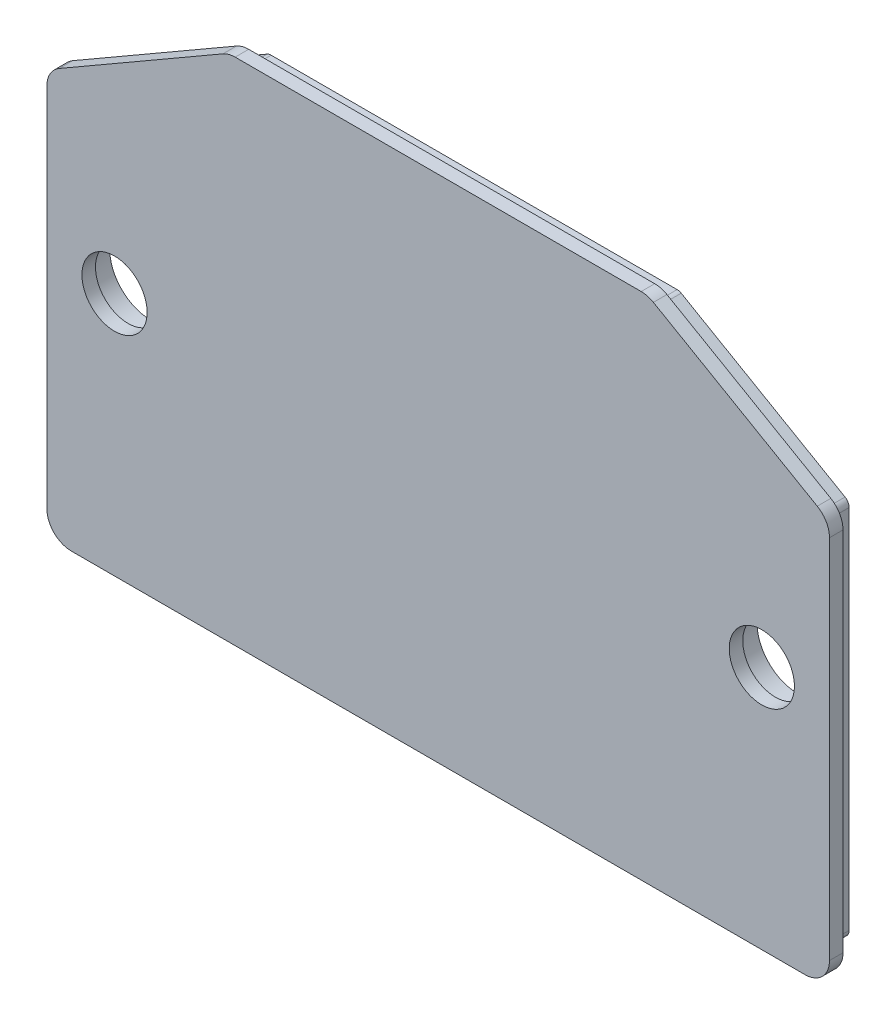
ISO-10303-21;
HEADER;
FILE_DESCRIPTION(('STEP AP214'),'2;1');
FILE_NAME('part.step','',(''),(''),'','','');
FILE_SCHEMA(('AUTOMOTIVE_DESIGN { 1 0 10303 214 1 1 1 1 }'));
ENDSEC;
DATA;
#1=APPLICATION_CONTEXT('core data for automotive mechanical design processes');
#2=APPLICATION_PROTOCOL_DEFINITION('international standard','automotive_design',2000,#1);
#3=PRODUCT_CONTEXT('',#1,'mechanical');
#4=PRODUCT('Part','Part','',(#3));
#5=PRODUCT_RELATED_PRODUCT_CATEGORY('part','',(#4));
#6=PRODUCT_DEFINITION_FORMATION('','',#4);
#7=PRODUCT_DEFINITION_CONTEXT('part definition',#1,'design');
#8=PRODUCT_DEFINITION('design','',#6,#7);
#9=PRODUCT_DEFINITION_SHAPE('','',#8);
#10=(LENGTH_UNIT() NAMED_UNIT(*) SI_UNIT(.MILLI.,.METRE.));
#11=(NAMED_UNIT(*) PLANE_ANGLE_UNIT() SI_UNIT($,.RADIAN.));
#12=(NAMED_UNIT(*) SI_UNIT($,.STERADIAN.) SOLID_ANGLE_UNIT());
#13=UNCERTAINTY_MEASURE_WITH_UNIT(LENGTH_MEASURE(1.E-05),#10,'distance_accuracy_value','');
#14=(GEOMETRIC_REPRESENTATION_CONTEXT(3) GLOBAL_UNCERTAINTY_ASSIGNED_CONTEXT((#13)) GLOBAL_UNIT_ASSIGNED_CONTEXT((#10,
#11,#12)) REPRESENTATION_CONTEXT('',''));
#15=CARTESIAN_POINT('',(0.,0.,0.));
#16=DIRECTION('',(0.,0.,1.));
#17=DIRECTION('',(1.,0.,0.));
#18=AXIS2_PLACEMENT_3D('',#15,#16,#17);
#19=CARTESIAN_POINT('',(0.,0.,-25.271));
#20=DIRECTION('',(0.,0.,-1.));
#21=DIRECTION('',(-1.,0.,0.));
#22=AXIS2_PLACEMENT_3D('',#19,#20,#21);
#23=PLANE('',#22);
#24=CARTESIAN_POINT('',(8.87,-19.26674933975,-25.271));
#25=DIRECTION('',(0.,0.,-1.));
#26=DIRECTION('',(-1.,0.,0.));
#27=AXIS2_PLACEMENT_3D('',#24,#25,#26);
#28=CIRCLE('',#27,0.5);
#29=CARTESIAN_POINT('',(8.37,-19.26674933975,-25.271));
#30=VERTEX_POINT('',#29);
#31=EDGE_CURVE('E201',#30,#30,#28,.F.);
#32=ORIENTED_EDGE('',*,*,#31,.T.);
#33=EDGE_LOOP('',(#32));
#34=FACE_BOUND('',#33,.T.);
#35=CARTESIAN_POINT('',(0.93,-19.26674933975,-25.271));
#36=DIRECTION('',(0.,0.,-1.));
#37=DIRECTION('',(-1.,0.,0.));
#38=AXIS2_PLACEMENT_3D('',#35,#36,#37);
#39=CIRCLE('',#38,0.5);
#40=CARTESIAN_POINT('',(0.43,-19.26674933975,-25.271));
#41=VERTEX_POINT('',#40);
#42=EDGE_CURVE('E198',#41,#41,#39,.F.);
#43=ORIENTED_EDGE('',*,*,#42,.T.);
#44=EDGE_LOOP('',(#43));
#45=FACE_BOUND('',#44,.T.);
#46=CARTESIAN_POINT('',(2.410031582968,-16.31454744111,-25.271));
#47=DIRECTION('',(0.,0.,-1.));
#48=DIRECTION('',(-1.,0.,0.));
#49=AXIS2_PLACEMENT_3D('',#46,#47,#48);
#50=CIRCLE('',#49,0.1);
#51=CARTESIAN_POINT('',(2.410031582968,-16.21454744111,-25.271));
#52=VERTEX_POINT('',#51);
#53=CARTESIAN_POINT('',(2.36003158296767,-16.2279449007302,-25.271));
#54=VERTEX_POINT('',#53);
#55=EDGE_CURVE('E19',#52,#54,#50,.F.);
#56=ORIENTED_EDGE('',*,*,#55,.F.);
#57=DIRECTION('',(1.,0.,0.));
#58=VECTOR('',#57,1.);
#59=CARTESIAN_POINT('',(7.389968417032,-16.21454744111,-25.271));
#60=LINE('',#59,#58);
#61=CARTESIAN_POINT('',(7.389968417032,-16.21454744111,-25.271));
#62=VERTEX_POINT('',#61);
#63=EDGE_CURVE('E175',#52,#62,#60,.T.);
#64=ORIENTED_EDGE('',*,*,#63,.T.);
#65=CARTESIAN_POINT('',(7.389968417032,-16.31454744111,-25.271));
#66=DIRECTION('',(0.,0.,-1.));
#67=DIRECTION('',(-1.,0.,0.));
#68=AXIS2_PLACEMENT_3D('',#65,#66,#67);
#69=CIRCLE('',#68,0.1);
#70=CARTESIAN_POINT('',(7.43996841703119,-16.2279449007322,-25.271));
#71=VERTEX_POINT('',#70);
#72=EDGE_CURVE('E186',#71,#62,#69,.F.);
#73=ORIENTED_EDGE('',*,*,#72,.F.);
#74=DIRECTION('',(0.866025403784429,-0.500000000000017,0.));
#75=VECTOR('',#74,1.);
#76=CARTESIAN_POINT('',(9.45,-17.38843717624,-25.271));
#77=LINE('',#76,#75);
#78=CARTESIAN_POINT('',(9.45000000000034,-17.3884371762402,-25.271));
#79=VERTEX_POINT('',#78);
#80=EDGE_CURVE('E212',#71,#79,#77,.T.);
#81=ORIENTED_EDGE('',*,*,#80,.T.);
#82=CARTESIAN_POINT('',(9.4,-17.47503971662,-25.271));
#83=DIRECTION('',(0.,0.,-1.));
#84=DIRECTION('',(-1.,0.,0.));
#85=AXIS2_PLACEMENT_3D('',#82,#83,#84);
#86=CIRCLE('',#85,0.1);
#87=CARTESIAN_POINT('',(9.5,-17.47503971662,-25.271));
#88=VERTEX_POINT('',#87);
#89=EDGE_CURVE('E216',#88,#79,#86,.F.);
#90=ORIENTED_EDGE('',*,*,#89,.F.);
#91=DIRECTION('',(0.,1.,0.));
#92=VECTOR('',#91,1.);
#93=CARTESIAN_POINT('',(9.5,-21.96674933975,-25.271));
#94=LINE('',#93,#92);
#95=CARTESIAN_POINT('',(9.5,-21.96674933975,-25.271));
#96=VERTEX_POINT('',#95);
#97=EDGE_CURVE('E220',#88,#96,#94,.F.);
#98=ORIENTED_EDGE('',*,*,#97,.T.);
#99=CARTESIAN_POINT('',(9.4,-21.96674933975,-25.271));
#100=DIRECTION('',(0.,0.,-1.));
#101=DIRECTION('',(-1.,0.,0.));
#102=AXIS2_PLACEMENT_3D('',#99,#100,#101);
#103=CIRCLE('',#102,0.1);
#104=CARTESIAN_POINT('',(9.4,-22.06674933975,-25.271));
#105=VERTEX_POINT('',#104);
#106=EDGE_CURVE('E224',#105,#96,#103,.F.);
#107=ORIENTED_EDGE('',*,*,#106,.F.);
#108=DIRECTION('',(1.,0.,0.));
#109=VECTOR('',#108,1.);
#110=CARTESIAN_POINT('',(0.4,-22.06674933975,-25.271));
#111=LINE('',#110,#109);
#112=CARTESIAN_POINT('',(0.4,-22.06674933975,-25.271));
#113=VERTEX_POINT('',#112);
#114=EDGE_CURVE('E228',#105,#113,#111,.F.);
#115=ORIENTED_EDGE('',*,*,#114,.T.);
#116=CARTESIAN_POINT('',(0.4,-21.96674933975,-25.271));
#117=DIRECTION('',(0.,0.,-1.));
#118=DIRECTION('',(-1.,0.,0.));
#119=AXIS2_PLACEMENT_3D('',#116,#117,#118);
#120=CIRCLE('',#119,0.1);
#121=CARTESIAN_POINT('',(0.3,-21.96674933975,-25.271));
#122=VERTEX_POINT('',#121);
#123=EDGE_CURVE('E232',#122,#113,#120,.F.);
#124=ORIENTED_EDGE('',*,*,#123,.F.);
#125=DIRECTION('',(0.,1.,0.));
#126=VECTOR('',#125,1.);
#127=CARTESIAN_POINT('',(0.3,-17.47503971662,-25.271));
#128=LINE('',#127,#126);
#129=CARTESIAN_POINT('',(0.3,-17.47503971662,-25.271));
#130=VERTEX_POINT('',#129);
#131=EDGE_CURVE('E236',#122,#130,#128,.T.);
#132=ORIENTED_EDGE('',*,*,#131,.T.);
#133=CARTESIAN_POINT('',(0.4,-17.47503971662,-25.271));
#134=DIRECTION('',(0.,0.,-1.));
#135=DIRECTION('',(-1.,0.,0.));
#136=AXIS2_PLACEMENT_3D('',#133,#134,#135);
#137=CIRCLE('',#136,0.1);
#138=CARTESIAN_POINT('',(0.349999999999194,-17.3884371762394,-25.271));
#139=VERTEX_POINT('',#138);
#140=EDGE_CURVE('E240',#139,#130,#137,.F.);
#141=ORIENTED_EDGE('',*,*,#140,.F.);
#142=DIRECTION('',(0.866025403784429,0.500000000000017,0.));
#143=VECTOR('',#142,1.);
#144=CARTESIAN_POINT('',(2.360031582968,-16.22794490073,-25.271));
#145=LINE('',#144,#143);
#146=EDGE_CURVE('E191',#139,#54,#145,.T.);
#147=ORIENTED_EDGE('',*,*,#146,.T.);
#148=EDGE_LOOP('',(#56,#64,#73,#81,#90,#98,#107,#115,#124,#132,#141,#147));
#149=FACE_BOUND('',#148,.T.);
#150=ADVANCED_FACE('F16',(#34,#45,#149),#23,.T.);
#151=CARTESIAN_POINT('',(2.410031582968,-16.31454744111,-25.271));
#152=DIRECTION('',(0.,0.,-1.));
#153=DIRECTION('',(-1.,0.,0.));
#154=AXIS2_PLACEMENT_3D('',#151,#152,#153);
#155=CYLINDRICAL_SURFACE('',#154,0.1);
#156=DIRECTION('',(0.,0.,-1.));
#157=VECTOR('',#156,1.);
#158=CARTESIAN_POINT('',(2.410031582968,-16.21454744111,-25.271));
#159=LINE('',#158,#157);
#160=CARTESIAN_POINT('',(2.410031582968,-16.21454744111,-24.996));
#161=VERTEX_POINT('',#160);
#162=EDGE_CURVE('E180',#161,#52,#159,.T.);
#163=ORIENTED_EDGE('',*,*,#162,.T.);
#164=ORIENTED_EDGE('',*,*,#55,.T.);
#165=DIRECTION('',(0.,0.,1.));
#166=VECTOR('',#165,1.);
#167=CARTESIAN_POINT('',(2.360031582968,-16.22794490073,-25.271));
#168=LINE('',#167,#166);
#169=CARTESIAN_POINT('',(2.36003158296761,-16.2279449007302,-24.996));
#170=VERTEX_POINT('',#169);
#171=EDGE_CURVE('E241',#54,#170,#168,.T.);
#172=ORIENTED_EDGE('',*,*,#171,.T.);
#173=CARTESIAN_POINT('',(2.410031582968,-16.31454744111,-24.996));
#174=DIRECTION('',(0.,0.,-1.));
#175=DIRECTION('',(-1.,0.,0.));
#176=AXIS2_PLACEMENT_3D('',#173,#174,#175);
#177=CIRCLE('',#176,0.1);
#178=EDGE_CURVE('E197',#161,#170,#177,.F.);
#179=ORIENTED_EDGE('',*,*,#178,.F.);
#180=EDGE_LOOP('',(#163,#164,#172,#179));
#181=FACE_BOUND('',#180,.T.);
#182=ADVANCED_FACE('F196',(#181),#155,.T.);
#183=CARTESIAN_POINT('',(2.360031582968,-16.22794490073,-25.271));
#184=DIRECTION('',(0.500000000000017,-0.866025403784429,0.));
#185=DIRECTION('',(0.866025403784429,0.500000000000017,0.));
#186=AXIS2_PLACEMENT_3D('',#183,#184,#185);
#187=PLANE('',#186);
#188=DIRECTION('',(-0.866025403783734,-0.50000000000122,0.));
#189=VECTOR('',#188,1.);
#190=CARTESIAN_POINT('',(2.360031582968,-16.22794490073,-24.996));
#191=LINE('',#190,#189);
#192=CARTESIAN_POINT('',(0.349999999999939,-17.3884371762408,-24.996));
#193=VERTEX_POINT('',#192);
#194=EDGE_CURVE('E333',#170,#193,#191,.T.);
#195=ORIENTED_EDGE('',*,*,#194,.F.);
#196=ORIENTED_EDGE('',*,*,#171,.F.);
#197=ORIENTED_EDGE('',*,*,#146,.F.);
#198=DIRECTION('',(0.,0.,-1.));
#199=VECTOR('',#198,1.);
#200=CARTESIAN_POINT('',(0.350000000000674,-17.3884371762412,-25.271));
#201=LINE('',#200,#199);
#202=EDGE_CURVE('E237',#193,#139,#201,.T.);
#203=ORIENTED_EDGE('',*,*,#202,.F.);
#204=EDGE_LOOP('',(#195,#196,#197,#203));
#205=FACE_BOUND('',#204,.T.);
#206=ADVANCED_FACE('F403',(#205),#187,.F.);
#207=CARTESIAN_POINT('',(0.4,-17.47503971662,-25.271));
#208=DIRECTION('',(0.,0.,-1.));
#209=DIRECTION('',(-1.,0.,0.));
#210=AXIS2_PLACEMENT_3D('',#207,#208,#209);
#211=CYLINDRICAL_SURFACE('',#210,0.1);
#212=ORIENTED_EDGE('',*,*,#202,.T.);
#213=ORIENTED_EDGE('',*,*,#140,.T.);
#214=DIRECTION('',(0.,0.,-1.));
#215=VECTOR('',#214,1.);
#216=CARTESIAN_POINT('',(0.3,-17.47503971662,-25.271));
#217=LINE('',#216,#215);
#218=CARTESIAN_POINT('',(0.3,-17.47503971662,-24.996));
#219=VERTEX_POINT('',#218);
#220=EDGE_CURVE('E233',#130,#219,#217,.F.);
#221=ORIENTED_EDGE('',*,*,#220,.T.);
#222=CARTESIAN_POINT('',(0.4,-17.47503971662,-24.996));
#223=DIRECTION('',(0.,0.,-1.));
#224=DIRECTION('',(-1.,0.,0.));
#225=AXIS2_PLACEMENT_3D('',#222,#223,#224);
#226=CIRCLE('',#225,0.1);
#227=EDGE_CURVE('E331',#193,#219,#226,.F.);
#228=ORIENTED_EDGE('',*,*,#227,.F.);
#229=EDGE_LOOP('',(#212,#213,#221,#228));
#230=FACE_BOUND('',#229,.T.);
#231=ADVANCED_FACE('F342',(#230),#211,.T.);
#232=CARTESIAN_POINT('',(0.3,-17.47503971662,-25.271));
#233=DIRECTION('',(1.,0.,0.));
#234=DIRECTION('',(0.,0.,-1.));
#235=AXIS2_PLACEMENT_3D('',#232,#233,#234);
#236=PLANE('',#235);
#237=DIRECTION('',(0.,1.,0.));
#238=VECTOR('',#237,1.);
#239=CARTESIAN_POINT('',(0.3,0.,-24.996));
#240=LINE('',#239,#238);
#241=CARTESIAN_POINT('',(0.3,-21.96674933975,-24.996));
#242=VERTEX_POINT('',#241);
#243=EDGE_CURVE('E330',#219,#242,#240,.F.);
#244=ORIENTED_EDGE('',*,*,#243,.F.);
#245=ORIENTED_EDGE('',*,*,#220,.F.);
#246=ORIENTED_EDGE('',*,*,#131,.F.);
#247=DIRECTION('',(0.,0.,-1.));
#248=VECTOR('',#247,1.);
#249=CARTESIAN_POINT('',(0.3,-21.96674933975,-25.271));
#250=LINE('',#249,#248);
#251=EDGE_CURVE('E229',#242,#122,#250,.T.);
#252=ORIENTED_EDGE('',*,*,#251,.F.);
#253=EDGE_LOOP('',(#244,#245,#246,#252));
#254=FACE_BOUND('',#253,.T.);
#255=ADVANCED_FACE('F347',(#254),#236,.F.);
#256=CARTESIAN_POINT('',(0.4,-21.96674933975,-25.271));
#257=DIRECTION('',(0.,0.,-1.));
#258=DIRECTION('',(-1.,0.,0.));
#259=AXIS2_PLACEMENT_3D('',#256,#257,#258);
#260=CYLINDRICAL_SURFACE('',#259,0.1);
#261=ORIENTED_EDGE('',*,*,#251,.T.);
#262=ORIENTED_EDGE('',*,*,#123,.T.);
#263=DIRECTION('',(0.,0.,1.));
#264=VECTOR('',#263,1.);
#265=CARTESIAN_POINT('',(0.4,-22.06674933975,-25.271));
#266=LINE('',#265,#264);
#267=CARTESIAN_POINT('',(0.4,-22.06674933975,-24.996));
#268=VERTEX_POINT('',#267);
#269=EDGE_CURVE('E225',#113,#268,#266,.T.);
#270=ORIENTED_EDGE('',*,*,#269,.T.);
#271=CARTESIAN_POINT('',(0.4,-21.96674933975,-24.996));
#272=DIRECTION('',(0.,0.,-1.));
#273=DIRECTION('',(-1.,0.,0.));
#274=AXIS2_PLACEMENT_3D('',#271,#272,#273);
#275=CIRCLE('',#274,0.1);
#276=EDGE_CURVE('E328',#242,#268,#275,.F.);
#277=ORIENTED_EDGE('',*,*,#276,.F.);
#278=EDGE_LOOP('',(#261,#262,#270,#277));
#279=FACE_BOUND('',#278,.T.);
#280=ADVANCED_FACE('F353',(#279),#260,.T.);
#281=CARTESIAN_POINT('',(0.4,-22.06674933975,-25.271));
#282=DIRECTION('',(0.,1.,0.));
#283=DIRECTION('',(0.,0.,1.));
#284=AXIS2_PLACEMENT_3D('',#281,#282,#283);
#285=PLANE('',#284);
#286=DIRECTION('',(-1.,0.,0.));
#287=VECTOR('',#286,1.);
#288=CARTESIAN_POINT('',(0.,-22.06674933975,-24.996));
#289=LINE('',#288,#287);
#290=CARTESIAN_POINT('',(9.4,-22.06674933975,-24.996));
#291=VERTEX_POINT('',#290);
#292=EDGE_CURVE('E327',#268,#291,#289,.F.);
#293=ORIENTED_EDGE('',*,*,#292,.F.);
#294=ORIENTED_EDGE('',*,*,#269,.F.);
#295=ORIENTED_EDGE('',*,*,#114,.F.);
#296=DIRECTION('',(0.,0.,-1.));
#297=VECTOR('',#296,1.);
#298=CARTESIAN_POINT('',(9.4,-22.06674933975,-25.271));
#299=LINE('',#298,#297);
#300=EDGE_CURVE('E221',#291,#105,#299,.T.);
#301=ORIENTED_EDGE('',*,*,#300,.F.);
#302=EDGE_LOOP('',(#293,#294,#295,#301));
#303=FACE_BOUND('',#302,.T.);
#304=ADVANCED_FACE('F357',(#303),#285,.F.);
#305=CARTESIAN_POINT('',(9.4,-21.96674933975,-25.271));
#306=DIRECTION('',(0.,0.,-1.));
#307=DIRECTION('',(-1.,0.,0.));
#308=AXIS2_PLACEMENT_3D('',#305,#306,#307);
#309=CYLINDRICAL_SURFACE('',#308,0.1);
#310=ORIENTED_EDGE('',*,*,#300,.T.);
#311=ORIENTED_EDGE('',*,*,#106,.T.);
#312=DIRECTION('',(0.,0.,1.));
#313=VECTOR('',#312,1.);
#314=CARTESIAN_POINT('',(9.5,-21.96674933975,-25.271));
#315=LINE('',#314,#313);
#316=CARTESIAN_POINT('',(9.5,-21.96674933975,-24.996));
#317=VERTEX_POINT('',#316);
#318=EDGE_CURVE('E217',#96,#317,#315,.T.);
#319=ORIENTED_EDGE('',*,*,#318,.T.);
#320=CARTESIAN_POINT('',(9.4,-21.96674933975,-24.996));
#321=DIRECTION('',(0.,0.,-1.));
#322=DIRECTION('',(-1.,0.,0.));
#323=AXIS2_PLACEMENT_3D('',#320,#321,#322);
#324=CIRCLE('',#323,0.1);
#325=EDGE_CURVE('E325',#291,#317,#324,.F.);
#326=ORIENTED_EDGE('',*,*,#325,.F.);
#327=EDGE_LOOP('',(#310,#311,#319,#326));
#328=FACE_BOUND('',#327,.T.);
#329=ADVANCED_FACE('F508',(#328),#309,.T.);
#330=CARTESIAN_POINT('',(9.5,-21.96674933975,-25.271));
#331=DIRECTION('',(-1.,0.,0.));
#332=DIRECTION('',(0.,0.,1.));
#333=AXIS2_PLACEMENT_3D('',#330,#331,#332);
#334=PLANE('',#333);
#335=DIRECTION('',(0.,1.,0.));
#336=VECTOR('',#335,1.);
#337=CARTESIAN_POINT('',(9.5,0.,-24.996));
#338=LINE('',#337,#336);
#339=CARTESIAN_POINT('',(9.5,-17.47503971662,-24.996));
#340=VERTEX_POINT('',#339);
#341=EDGE_CURVE('E324',#317,#340,#338,.T.);
#342=ORIENTED_EDGE('',*,*,#341,.F.);
#343=ORIENTED_EDGE('',*,*,#318,.F.);
#344=ORIENTED_EDGE('',*,*,#97,.F.);
#345=DIRECTION('',(0.,0.,-1.));
#346=VECTOR('',#345,1.);
#347=CARTESIAN_POINT('',(9.5,-17.47503971662,-25.271));
#348=LINE('',#347,#346);
#349=EDGE_CURVE('E213',#340,#88,#348,.T.);
#350=ORIENTED_EDGE('',*,*,#349,.F.);
#351=EDGE_LOOP('',(#342,#343,#344,#350));
#352=FACE_BOUND('',#351,.T.);
#353=ADVANCED_FACE('F504',(#352),#334,.F.);
#354=CARTESIAN_POINT('',(9.4,-17.47503971662,-25.271));
#355=DIRECTION('',(0.,0.,-1.));
#356=DIRECTION('',(-1.,0.,0.));
#357=AXIS2_PLACEMENT_3D('',#354,#355,#356);
#358=CYLINDRICAL_SURFACE('',#357,0.1);
#359=ORIENTED_EDGE('',*,*,#349,.T.);
#360=ORIENTED_EDGE('',*,*,#89,.T.);
#361=DIRECTION('',(0.,0.,1.));
#362=VECTOR('',#361,1.);
#363=CARTESIAN_POINT('',(9.45,-17.38843717624,-25.271));
#364=LINE('',#363,#362);
#365=CARTESIAN_POINT('',(9.4500000000004,-17.3884371762403,-24.996));
#366=VERTEX_POINT('',#365);
#367=EDGE_CURVE('E209',#79,#366,#364,.T.);
#368=ORIENTED_EDGE('',*,*,#367,.T.);
#369=CARTESIAN_POINT('',(9.4,-17.47503971662,-24.996));
#370=DIRECTION('',(0.,0.,-1.));
#371=DIRECTION('',(-1.,0.,0.));
#372=AXIS2_PLACEMENT_3D('',#369,#370,#371);
#373=CIRCLE('',#372,0.1);
#374=EDGE_CURVE('E322',#340,#366,#373,.F.);
#375=ORIENTED_EDGE('',*,*,#374,.F.);
#376=EDGE_LOOP('',(#359,#360,#368,#375));
#377=FACE_BOUND('',#376,.T.);
#378=ADVANCED_FACE('F501',(#377),#358,.T.);
#379=CARTESIAN_POINT('',(9.45,-17.38843717624,-25.271));
#380=DIRECTION('',(-0.500000000000017,-0.866025403784429,0.));
#381=DIRECTION('',(0.866025403784429,-0.500000000000017,0.));
#382=AXIS2_PLACEMENT_3D('',#379,#380,#381);
#383=PLANE('',#382);
#384=DIRECTION('',(-0.866025403783734,0.50000000000122,0.));
#385=VECTOR('',#384,1.);
#386=CARTESIAN_POINT('',(9.45,-17.38843717624,-24.996));
#387=LINE('',#386,#385);
#388=CARTESIAN_POINT('',(7.43996841703206,-16.2279449007308,-24.996));
#389=VERTEX_POINT('',#388);
#390=EDGE_CURVE('E321',#366,#389,#387,.T.);
#391=ORIENTED_EDGE('',*,*,#390,.F.);
#392=ORIENTED_EDGE('',*,*,#367,.F.);
#393=ORIENTED_EDGE('',*,*,#80,.F.);
#394=DIRECTION('',(0.,0.,-1.));
#395=VECTOR('',#394,1.);
#396=CARTESIAN_POINT('',(7.43996841703133,-16.2279449007311,-25.271));
#397=LINE('',#396,#395);
#398=EDGE_CURVE('E206',#389,#71,#397,.T.);
#399=ORIENTED_EDGE('',*,*,#398,.F.);
#400=EDGE_LOOP('',(#391,#392,#393,#399));
#401=FACE_BOUND('',#400,.T.);
#402=ADVANCED_FACE('F398',(#401),#383,.F.);
#403=CARTESIAN_POINT('',(7.389968417032,-16.31454744111,-25.271));
#404=DIRECTION('',(0.,0.,-1.));
#405=DIRECTION('',(-1.,0.,0.));
#406=AXIS2_PLACEMENT_3D('',#403,#404,#405);
#407=CYLINDRICAL_SURFACE('',#406,0.1);
#408=ORIENTED_EDGE('',*,*,#398,.T.);
#409=ORIENTED_EDGE('',*,*,#72,.T.);
#410=DIRECTION('',(0.,0.,-1.));
#411=VECTOR('',#410,1.);
#412=CARTESIAN_POINT('',(7.389968417032,-16.21454744111,-25.271));
#413=LINE('',#412,#411);
#414=CARTESIAN_POINT('',(7.389968417032,-16.21454744111,-24.996));
#415=VERTEX_POINT('',#414);
#416=EDGE_CURVE('E183',#62,#415,#413,.F.);
#417=ORIENTED_EDGE('',*,*,#416,.T.);
#418=CARTESIAN_POINT('',(7.389968417032,-16.31454744111,-24.996));
#419=DIRECTION('',(0.,0.,-1.));
#420=DIRECTION('',(-1.,0.,0.));
#421=AXIS2_PLACEMENT_3D('',#418,#419,#420);
#422=CIRCLE('',#421,0.1);
#423=EDGE_CURVE('E319',#389,#415,#422,.F.);
#424=ORIENTED_EDGE('',*,*,#423,.F.);
#425=EDGE_LOOP('',(#408,#409,#417,#424));
#426=FACE_BOUND('',#425,.T.);
#427=ADVANCED_FACE('F400',(#426),#407,.T.);
#428=CARTESIAN_POINT('',(7.389968417032,-16.21454744111,-25.271));
#429=DIRECTION('',(0.,-1.,0.));
#430=DIRECTION('',(0.,0.,-1.));
#431=AXIS2_PLACEMENT_3D('',#428,#429,#430);
#432=PLANE('',#431);
#433=DIRECTION('',(-1.,0.,0.));
#434=VECTOR('',#433,1.);
#435=CARTESIAN_POINT('',(0.,-16.21454744111,-24.996));
#436=LINE('',#435,#434);
#437=EDGE_CURVE('E318',#415,#161,#436,.T.);
#438=ORIENTED_EDGE('',*,*,#437,.F.);
#439=ORIENTED_EDGE('',*,*,#416,.F.);
#440=ORIENTED_EDGE('',*,*,#63,.F.);
#441=ORIENTED_EDGE('',*,*,#162,.F.);
#442=EDGE_LOOP('',(#438,#439,#440,#441));
#443=FACE_BOUND('',#442,.T.);
#444=ADVANCED_FACE('F178',(#443),#432,.F.);
#445=CARTESIAN_POINT('',(0.93,-19.26674933975,-25.271));
#446=DIRECTION('',(0.,0.,-1.));
#447=DIRECTION('',(-1.,0.,0.));
#448=AXIS2_PLACEMENT_3D('',#445,#446,#447);
#449=CYLINDRICAL_SURFACE('',#448,0.5);
#450=CARTESIAN_POINT('',(0.93,-19.26674933975,-24.996));
#451=DIRECTION('',(0.,0.,-1.));
#452=DIRECTION('',(-1.,0.,0.));
#453=AXIS2_PLACEMENT_3D('',#450,#451,#452);
#454=CIRCLE('',#453,0.5);
#455=CARTESIAN_POINT('',(0.43,-19.26674933975,-24.996));
#456=VERTEX_POINT('',#455);
#457=EDGE_CURVE('E315',#456,#456,#454,.T.);
#458=ORIENTED_EDGE('',*,*,#457,.F.);
#459=EDGE_LOOP('',(#458));
#460=FACE_BOUND('',#459,.T.);
#461=ORIENTED_EDGE('',*,*,#42,.F.);
#462=EDGE_LOOP('',(#461));
#463=FACE_BOUND('',#462,.T.);
#464=ADVANCED_FACE('F490',(#460,#463),#449,.F.);
#465=CARTESIAN_POINT('',(8.87,-19.26674933975,-25.271));
#466=DIRECTION('',(0.,0.,-1.));
#467=DIRECTION('',(-1.,0.,0.));
#468=AXIS2_PLACEMENT_3D('',#465,#466,#467);
#469=CYLINDRICAL_SURFACE('',#468,0.5);
#470=CARTESIAN_POINT('',(8.87,-19.26674933975,-24.996));
#471=DIRECTION('',(0.,0.,-1.));
#472=DIRECTION('',(-1.,0.,0.));
#473=AXIS2_PLACEMENT_3D('',#470,#471,#472);
#474=CIRCLE('',#473,0.5);
#475=CARTESIAN_POINT('',(8.37,-19.26674933975,-24.996));
#476=VERTEX_POINT('',#475);
#477=EDGE_CURVE('E312',#476,#476,#474,.T.);
#478=ORIENTED_EDGE('',*,*,#477,.F.);
#479=EDGE_LOOP('',(#478));
#480=FACE_BOUND('',#479,.T.);
#481=ORIENTED_EDGE('',*,*,#31,.F.);
#482=EDGE_LOOP('',(#481));
#483=FACE_BOUND('',#482,.T.);
#484=ADVANCED_FACE('F487',(#480,#483),#469,.F.);
#485=CARTESIAN_POINT('',(0.,0.,-24.996));
#486=DIRECTION('',(0.,0.,-1.));
#487=DIRECTION('',(-1.,0.,0.));
#488=AXIS2_PLACEMENT_3D('',#485,#486,#487);
#489=PLANE('',#488);
#490=ORIENTED_EDGE('',*,*,#423,.T.);
#491=ORIENTED_EDGE('',*,*,#437,.T.);
#492=ORIENTED_EDGE('',*,*,#178,.T.);
#493=ORIENTED_EDGE('',*,*,#194,.T.);
#494=ORIENTED_EDGE('',*,*,#227,.T.);
#495=ORIENTED_EDGE('',*,*,#243,.T.);
#496=ORIENTED_EDGE('',*,*,#276,.T.);
#497=ORIENTED_EDGE('',*,*,#292,.T.);
#498=ORIENTED_EDGE('',*,*,#325,.T.);
#499=ORIENTED_EDGE('',*,*,#341,.T.);
#500=ORIENTED_EDGE('',*,*,#374,.T.);
#501=ORIENTED_EDGE('',*,*,#390,.T.);
#502=EDGE_LOOP('',(#490,#491,#492,#493,#494,#495,#496,#497,#498,#499,#500,#501));
#503=FACE_BOUND('',#502,.T.);
#504=CARTESIAN_POINT('',(7.389968417032,-16.31454744111,-24.996));
#505=DIRECTION('',(0.,0.,1.));
#506=DIRECTION('',(1.,0.,0.));
#507=AXIS2_PLACEMENT_3D('',#504,#505,#506);
#508=CIRCLE('',#507,0.3);
#509=CARTESIAN_POINT('',(7.53996841703237,-16.0547398199717,-24.996));
#510=VERTEX_POINT('',#509);
#511=CARTESIAN_POINT('',(7.389968417032,-16.01454744111,-24.996));
#512=VERTEX_POINT('',#511);
#513=EDGE_CURVE('E299',#510,#512,#508,.T.);
#514=ORIENTED_EDGE('',*,*,#513,.F.);
#515=DIRECTION('',(-0.866025403784429,0.500000000000017,0.));
#516=VECTOR('',#515,1.);
#517=CARTESIAN_POINT('',(7.4,-15.97392901672,-24.996));
#518=LINE('',#517,#516);
#519=CARTESIAN_POINT('',(9.55000000000049,-17.2152320954815,-24.996));
#520=VERTEX_POINT('',#519);
#521=EDGE_CURVE('E375',#520,#510,#518,.T.);
#522=ORIENTED_EDGE('',*,*,#521,.F.);
#523=CARTESIAN_POINT('',(9.4,-17.47503971662,-24.996));
#524=DIRECTION('',(0.,0.,1.));
#525=DIRECTION('',(1.,0.,0.));
#526=AXIS2_PLACEMENT_3D('',#523,#524,#525);
#527=CIRCLE('',#526,0.3);
#528=CARTESIAN_POINT('',(9.7,-17.47503971662,-24.996));
#529=VERTEX_POINT('',#528);
#530=EDGE_CURVE('E294',#529,#520,#527,.T.);
#531=ORIENTED_EDGE('',*,*,#530,.F.);
#532=DIRECTION('',(0.,1.,0.));
#533=VECTOR('',#532,1.);
#534=CARTESIAN_POINT('',(9.7,-17.30183463586,-24.996));
#535=LINE('',#534,#533);
#536=CARTESIAN_POINT('',(9.7,-21.96674933975,-24.996));
#537=VERTEX_POINT('',#536);
#538=EDGE_CURVE('E372',#537,#529,#535,.T.);
#539=ORIENTED_EDGE('',*,*,#538,.F.);
#540=CARTESIAN_POINT('',(9.4,-21.96674933975,-24.996));
#541=DIRECTION('',(0.,0.,1.));
#542=DIRECTION('',(1.,0.,0.));
#543=AXIS2_PLACEMENT_3D('',#540,#541,#542);
#544=CIRCLE('',#543,0.3);
#545=CARTESIAN_POINT('',(9.4,-22.26674933975,-24.996));
#546=VERTEX_POINT('',#545);
#547=EDGE_CURVE('E289',#546,#537,#544,.T.);
#548=ORIENTED_EDGE('',*,*,#547,.F.);
#549=DIRECTION('',(1.,0.,0.));
#550=VECTOR('',#549,1.);
#551=CARTESIAN_POINT('',(9.7,-22.26674933975,-24.996));
#552=LINE('',#551,#550);
#553=CARTESIAN_POINT('',(0.4,-22.26674933975,-24.996));
#554=VERTEX_POINT('',#553);
#555=EDGE_CURVE('E369',#554,#546,#552,.T.);
#556=ORIENTED_EDGE('',*,*,#555,.F.);
#557=CARTESIAN_POINT('',(0.4,-21.96674933975,-24.996));
#558=DIRECTION('',(0.,0.,1.));
#559=DIRECTION('',(1.,0.,0.));
#560=AXIS2_PLACEMENT_3D('',#557,#558,#559);
#561=CIRCLE('',#560,0.3);
#562=CARTESIAN_POINT('',(0.1,-21.96674933975,-24.996));
#563=VERTEX_POINT('',#562);
#564=EDGE_CURVE('E285',#563,#554,#561,.T.);
#565=ORIENTED_EDGE('',*,*,#564,.F.);
#566=DIRECTION('',(0.,1.,0.));
#567=VECTOR('',#566,1.);
#568=CARTESIAN_POINT('',(0.1,-22.26674933975,-24.996));
#569=LINE('',#568,#567);
#570=CARTESIAN_POINT('',(0.1,-17.47503971662,-24.996));
#571=VERTEX_POINT('',#570);
#572=EDGE_CURVE('E284',#571,#563,#569,.F.);
#573=ORIENTED_EDGE('',*,*,#572,.F.);
#574=CARTESIAN_POINT('',(0.4,-17.47503971662,-24.996));
#575=DIRECTION('',(0.,0.,1.));
#576=DIRECTION('',(1.,0.,0.));
#577=AXIS2_PLACEMENT_3D('',#574,#575,#576);
#578=CIRCLE('',#577,0.3);
#579=CARTESIAN_POINT('',(0.24999999999966,-17.2152320954818,-24.996));
#580=VERTEX_POINT('',#579);
#581=EDGE_CURVE('E309',#580,#571,#578,.T.);
#582=ORIENTED_EDGE('',*,*,#581,.F.);
#583=DIRECTION('',(-0.866025403784429,-0.500000000000017,0.));
#584=VECTOR('',#583,1.);
#585=CARTESIAN_POINT('',(0.1,-17.30183463586,-24.996));
#586=LINE('',#585,#584);
#587=CARTESIAN_POINT('',(2.26003158296914,-16.0547398199743,-24.996));
#588=VERTEX_POINT('',#587);
#589=EDGE_CURVE('E379',#588,#580,#586,.T.);
#590=ORIENTED_EDGE('',*,*,#589,.F.);
#591=CARTESIAN_POINT('',(2.410031582968,-16.31454744111,-24.996));
#592=DIRECTION('',(0.,0.,-1.));
#593=DIRECTION('',(-1.,0.,0.));
#594=AXIS2_PLACEMENT_3D('',#591,#592,#593);
#595=CIRCLE('',#594,0.3);
#596=CARTESIAN_POINT('',(2.410031582968,-16.01454744111,-24.996));
#597=VERTEX_POINT('',#596);
#598=EDGE_CURVE('E304',#597,#588,#595,.F.);
#599=ORIENTED_EDGE('',*,*,#598,.F.);
#600=DIRECTION('',(1.,0.,0.));
#601=VECTOR('',#600,1.);
#602=CARTESIAN_POINT('',(9.4605,-16.01454744111,-24.996));
#603=LINE('',#602,#601);
#604=EDGE_CURVE('E307',#597,#512,#603,.T.);
#605=ORIENTED_EDGE('',*,*,#604,.T.);
#606=EDGE_LOOP('',(#514,#522,#531,#539,#548,#556,#565,#573,#582,#590,#599,#605));
#607=FACE_BOUND('',#606,.T.);
#608=ADVANCED_FACE('F392',(#503,#607),#489,.T.);
#609=CARTESIAN_POINT('',(0.,0.,-24.996));
#610=DIRECTION('',(0.,0.,-1.));
#611=DIRECTION('',(-1.,0.,0.));
#612=AXIS2_PLACEMENT_3D('',#609,#610,#611);
#613=PLANE('',#612);
#614=CARTESIAN_POINT('',(0.93,-19.26674933975,-24.996));
#615=DIRECTION('',(0.,0.,1.));
#616=DIRECTION('',(1.,0.,0.));
#617=AXIS2_PLACEMENT_3D('',#614,#615,#616);
#618=CIRCLE('',#617,0.4);
#619=CARTESIAN_POINT('',(1.33,-19.26674933975,-24.996));
#620=VERTEX_POINT('',#619);
#621=EDGE_CURVE('E281',#620,#620,#618,.T.);
#622=ORIENTED_EDGE('',*,*,#621,.T.);
#623=EDGE_LOOP('',(#622));
#624=FACE_BOUND('',#623,.T.);
#625=ORIENTED_EDGE('',*,*,#457,.T.);
#626=EDGE_LOOP('',(#625));
#627=FACE_BOUND('',#626,.T.);
#628=ADVANCED_FACE('F480',(#624,#627),#613,.T.);
#629=CARTESIAN_POINT('',(0.,0.,-24.996));
#630=DIRECTION('',(0.,0.,-1.));
#631=DIRECTION('',(-1.,0.,0.));
#632=AXIS2_PLACEMENT_3D('',#629,#630,#631);
#633=PLANE('',#632);
#634=CARTESIAN_POINT('',(8.87,-19.26674933975,-24.996));
#635=DIRECTION('',(0.,0.,1.));
#636=DIRECTION('',(1.,0.,0.));
#637=AXIS2_PLACEMENT_3D('',#634,#635,#636);
#638=CIRCLE('',#637,0.4);
#639=CARTESIAN_POINT('',(9.27,-19.26674933975,-24.996));
#640=VERTEX_POINT('',#639);
#641=EDGE_CURVE('E278',#640,#640,#638,.T.);
#642=ORIENTED_EDGE('',*,*,#641,.T.);
#643=EDGE_LOOP('',(#642));
#644=FACE_BOUND('',#643,.T.);
#645=ORIENTED_EDGE('',*,*,#477,.T.);
#646=EDGE_LOOP('',(#645));
#647=FACE_BOUND('',#646,.T.);
#648=ADVANCED_FACE('F476',(#644,#647),#633,.T.);
#649=CARTESIAN_POINT('',(0.4,-17.47503971662,-27.02967114666));
#650=DIRECTION('',(0.,0.,1.));
#651=DIRECTION('',(1.,0.,0.));
#652=AXIS2_PLACEMENT_3D('',#649,#650,#651);
#653=CYLINDRICAL_SURFACE('',#652,0.3);
#654=DIRECTION('',(0.,0.,1.));
#655=VECTOR('',#654,1.);
#656=CARTESIAN_POINT('',(0.250000000000672,-17.2152320954812,-25.271));
#657=LINE('',#656,#655);
#658=CARTESIAN_POINT('',(0.249999999999143,-17.2152320954813,-24.83));
#659=VERTEX_POINT('',#658);
#660=EDGE_CURVE('E311',#580,#659,#657,.T.);
#661=ORIENTED_EDGE('',*,*,#660,.F.);
#662=ORIENTED_EDGE('',*,*,#581,.T.);
#663=DIRECTION('',(0.,0.,1.));
#664=VECTOR('',#663,1.);
#665=CARTESIAN_POINT('',(0.1,-17.47503971662,-25.271));
#666=LINE('',#665,#664);
#667=CARTESIAN_POINT('',(0.1,-17.47503971662,-24.83));
#668=VERTEX_POINT('',#667);
#669=EDGE_CURVE('E368',#668,#571,#666,.F.);
#670=ORIENTED_EDGE('',*,*,#669,.F.);
#671=CARTESIAN_POINT('',(0.4,-17.47503971662,-24.83));
#672=DIRECTION('',(0.,0.,1.));
#673=DIRECTION('',(1.,0.,0.));
#674=AXIS2_PLACEMENT_3D('',#671,#672,#673);
#675=CIRCLE('',#674,0.3);
#676=EDGE_CURVE('E275',#668,#659,#675,.F.);
#677=ORIENTED_EDGE('',*,*,#676,.T.);
#678=EDGE_LOOP('',(#661,#662,#670,#677));
#679=FACE_BOUND('',#678,.T.);
#680=ADVANCED_FACE('F473',(#679),#653,.T.);
#681=CARTESIAN_POINT('',(0.1,-17.30183463586,-25.271));
#682=DIRECTION('',(-0.500000000000017,0.866025403784429,0.));
#683=DIRECTION('',(-0.866025403784429,-0.500000000000017,0.));
#684=AXIS2_PLACEMENT_3D('',#681,#682,#683);
#685=PLANE('',#684);
#686=DIRECTION('',(0.,0.,-1.));
#687=VECTOR('',#686,1.);
#688=CARTESIAN_POINT('',(2.26003158297002,-16.0547398199735,-22.16324083044));
#689=LINE('',#688,#687);
#690=CARTESIAN_POINT('',(2.26003158296782,-16.0547398199725,-24.83));
#691=VERTEX_POINT('',#690);
#692=EDGE_CURVE('E308',#588,#691,#689,.F.);
#693=ORIENTED_EDGE('',*,*,#692,.F.);
#694=ORIENTED_EDGE('',*,*,#589,.T.);
#695=ORIENTED_EDGE('',*,*,#660,.T.);
#696=DIRECTION('',(0.866025403783734,0.500000000001221,0.));
#697=VECTOR('',#696,1.);
#698=CARTESIAN_POINT('',(0.25,-17.21523209548,-24.83));
#699=LINE('',#698,#697);
#700=EDGE_CURVE('E274',#659,#691,#699,.T.);
#701=ORIENTED_EDGE('',*,*,#700,.T.);
#702=EDGE_LOOP('',(#693,#694,#695,#701));
#703=FACE_BOUND('',#702,.T.);
#704=ADVANCED_FACE('F469',(#703),#685,.T.);
#705=CARTESIAN_POINT('',(2.410031582968,-16.31454744111,-22.16324083044));
#706=DIRECTION('',(0.,0.,-1.));
#707=DIRECTION('',(-1.,0.,0.));
#708=AXIS2_PLACEMENT_3D('',#705,#706,#707);
#709=CYLINDRICAL_SURFACE('',#708,0.3);
#710=DIRECTION('',(0.,0.,-1.));
#711=VECTOR('',#710,1.);
#712=CARTESIAN_POINT('',(2.410031582968,-16.01454744111,-25.40590880229));
#713=LINE('',#712,#711);
#714=CARTESIAN_POINT('',(2.410031582968,-16.01454744111,-24.83));
#715=VERTEX_POINT('',#714);
#716=EDGE_CURVE('E378',#715,#597,#713,.T.);
#717=ORIENTED_EDGE('',*,*,#716,.T.);
#718=ORIENTED_EDGE('',*,*,#598,.T.);
#719=ORIENTED_EDGE('',*,*,#692,.T.);
#720=CARTESIAN_POINT('',(2.410031582968,-16.31454744111,-24.83));
#721=DIRECTION('',(0.,0.,-1.));
#722=DIRECTION('',(-1.,0.,0.));
#723=AXIS2_PLACEMENT_3D('',#720,#721,#722);
#724=CIRCLE('',#723,0.3);
#725=EDGE_CURVE('E271',#691,#715,#724,.T.);
#726=ORIENTED_EDGE('',*,*,#725,.T.);
#727=EDGE_LOOP('',(#717,#718,#719,#726));
#728=FACE_BOUND('',#727,.T.);
#729=ADVANCED_FACE('F465',(#728),#709,.T.);
#730=CARTESIAN_POINT('',(9.4605,-16.01454744111,-25.40590880229));
#731=DIRECTION('',(0.,-1.,0.));
#732=DIRECTION('',(0.,0.,-1.));
#733=AXIS2_PLACEMENT_3D('',#730,#731,#732);
#734=PLANE('',#733);
#735=DIRECTION('',(-1.,0.,0.));
#736=VECTOR('',#735,1.);
#737=CARTESIAN_POINT('',(0.,-16.01454744111,-24.83));
#738=LINE('',#737,#736);
#739=CARTESIAN_POINT('',(7.389968417032,-16.01454744111,-24.83));
#740=VERTEX_POINT('',#739);
#741=EDGE_CURVE('E270',#715,#740,#738,.F.);
#742=ORIENTED_EDGE('',*,*,#741,.T.);
#743=DIRECTION('',(0.,0.,1.));
#744=VECTOR('',#743,1.);
#745=CARTESIAN_POINT('',(7.389968417032,-16.01454744111,-27.02967114666));
#746=LINE('',#745,#744);
#747=EDGE_CURVE('E303',#512,#740,#746,.T.);
#748=ORIENTED_EDGE('',*,*,#747,.F.);
#749=ORIENTED_EDGE('',*,*,#604,.F.);
#750=ORIENTED_EDGE('',*,*,#716,.F.);
#751=EDGE_LOOP('',(#742,#748,#749,#750));
#752=FACE_BOUND('',#751,.T.);
#753=ADVANCED_FACE('F461',(#752),#734,.F.);
#754=CARTESIAN_POINT('',(7.389968417032,-16.31454744111,-27.02967114666));
#755=DIRECTION('',(0.,0.,1.));
#756=DIRECTION('',(1.,0.,0.));
#757=AXIS2_PLACEMENT_3D('',#754,#755,#756);
#758=CYLINDRICAL_SURFACE('',#757,0.3);
#759=DIRECTION('',(0.,0.,1.));
#760=VECTOR('',#759,1.);
#761=CARTESIAN_POINT('',(7.53996841703136,-16.0547398199711,-25.271));
#762=LINE('',#761,#760);
#763=CARTESIAN_POINT('',(7.53996841703288,-16.0547398199712,-24.83));
#764=VERTEX_POINT('',#763);
#765=EDGE_CURVE('E302',#510,#764,#762,.T.);
#766=ORIENTED_EDGE('',*,*,#765,.F.);
#767=ORIENTED_EDGE('',*,*,#513,.T.);
#768=ORIENTED_EDGE('',*,*,#747,.T.);
#769=CARTESIAN_POINT('',(7.389968417032,-16.31454744111,-24.83));
#770=DIRECTION('',(0.,0.,1.));
#771=DIRECTION('',(1.,0.,0.));
#772=AXIS2_PLACEMENT_3D('',#769,#770,#771);
#773=CIRCLE('',#772,0.3);
#774=EDGE_CURVE('E267',#740,#764,#773,.F.);
#775=ORIENTED_EDGE('',*,*,#774,.T.);
#776=EDGE_LOOP('',(#766,#767,#768,#775));
#777=FACE_BOUND('',#776,.T.);
#778=ADVANCED_FACE('F457',(#777),#758,.T.);
#779=CARTESIAN_POINT('',(7.4,-15.97392901672,-25.271));
#780=DIRECTION('',(0.500000000000017,0.866025403784429,0.));
#781=DIRECTION('',(-0.866025403784429,0.500000000000017,0.));
#782=AXIS2_PLACEMENT_3D('',#779,#780,#781);
#783=PLANE('',#782);
#784=DIRECTION('',(0.,0.,1.));
#785=VECTOR('',#784,1.);
#786=CARTESIAN_POINT('',(9.54999999999798,-17.2152320954835,-27.02967114666));
#787=LINE('',#786,#785);
#788=CARTESIAN_POINT('',(9.55000000000018,-17.2152320954825,-24.83));
#789=VERTEX_POINT('',#788);
#790=EDGE_CURVE('E298',#520,#789,#787,.T.);
#791=ORIENTED_EDGE('',*,*,#790,.F.);
#792=ORIENTED_EDGE('',*,*,#521,.T.);
#793=ORIENTED_EDGE('',*,*,#765,.T.);
#794=DIRECTION('',(0.866025403783734,-0.500000000001221,0.));
#795=VECTOR('',#794,1.);
#796=CARTESIAN_POINT('',(7.539968417032,-16.05473981997,-24.83));
#797=LINE('',#796,#795);
#798=EDGE_CURVE('E266',#764,#789,#797,.T.);
#799=ORIENTED_EDGE('',*,*,#798,.T.);
#800=EDGE_LOOP('',(#791,#792,#793,#799));
#801=FACE_BOUND('',#800,.T.);
#802=ADVANCED_FACE('F453',(#801),#783,.T.);
#803=CARTESIAN_POINT('',(9.4,-17.47503971662,-27.02967114666));
#804=DIRECTION('',(0.,0.,1.));
#805=DIRECTION('',(1.,0.,0.));
#806=AXIS2_PLACEMENT_3D('',#803,#804,#805);
#807=CYLINDRICAL_SURFACE('',#806,0.3);
#808=DIRECTION('',(0.,0.,-1.));
#809=VECTOR('',#808,1.);
#810=CARTESIAN_POINT('',(9.7,-17.47503971662,-25.271));
#811=LINE('',#810,#809);
#812=CARTESIAN_POINT('',(9.7,-17.47503971662,-24.83));
#813=VERTEX_POINT('',#812);
#814=EDGE_CURVE('E297',#529,#813,#811,.F.);
#815=ORIENTED_EDGE('',*,*,#814,.F.);
#816=ORIENTED_EDGE('',*,*,#530,.T.);
#817=ORIENTED_EDGE('',*,*,#790,.T.);
#818=CARTESIAN_POINT('',(9.4,-17.47503971662,-24.83));
#819=DIRECTION('',(0.,0.,1.));
#820=DIRECTION('',(1.,0.,0.));
#821=AXIS2_PLACEMENT_3D('',#818,#819,#820);
#822=CIRCLE('',#821,0.3);
#823=EDGE_CURVE('E263',#789,#813,#822,.F.);
#824=ORIENTED_EDGE('',*,*,#823,.T.);
#825=EDGE_LOOP('',(#815,#816,#817,#824));
#826=FACE_BOUND('',#825,.T.);
#827=ADVANCED_FACE('F449',(#826),#807,.T.);
#828=CARTESIAN_POINT('',(9.7,-17.30183463586,-25.271));
#829=DIRECTION('',(1.,0.,0.));
#830=DIRECTION('',(0.,0.,-1.));
#831=AXIS2_PLACEMENT_3D('',#828,#829,#830);
#832=PLANE('',#831);
#833=DIRECTION('',(0.,0.,1.));
#834=VECTOR('',#833,1.);
#835=CARTESIAN_POINT('',(9.7,-21.96674933975,-27.02967114666));
#836=LINE('',#835,#834);
#837=CARTESIAN_POINT('',(9.7,-21.96674933975,-24.83));
#838=VERTEX_POINT('',#837);
#839=EDGE_CURVE('E293',#537,#838,#836,.T.);
#840=ORIENTED_EDGE('',*,*,#839,.F.);
#841=ORIENTED_EDGE('',*,*,#538,.T.);
#842=ORIENTED_EDGE('',*,*,#814,.T.);
#843=DIRECTION('',(0.,1.,0.));
#844=VECTOR('',#843,1.);
#845=CARTESIAN_POINT('',(9.7,0.,-24.83));
#846=LINE('',#845,#844);
#847=EDGE_CURVE('E262',#813,#838,#846,.F.);
#848=ORIENTED_EDGE('',*,*,#847,.T.);
#849=EDGE_LOOP('',(#840,#841,#842,#848));
#850=FACE_BOUND('',#849,.T.);
#851=ADVANCED_FACE('F445',(#850),#832,.T.);
#852=CARTESIAN_POINT('',(9.4,-21.96674933975,-27.02967114666));
#853=DIRECTION('',(0.,0.,1.));
#854=DIRECTION('',(1.,0.,0.));
#855=AXIS2_PLACEMENT_3D('',#852,#853,#854);
#856=CYLINDRICAL_SURFACE('',#855,0.3);
#857=DIRECTION('',(0.,0.,-1.));
#858=VECTOR('',#857,1.);
#859=CARTESIAN_POINT('',(9.4,-22.26674933975,-25.271));
#860=LINE('',#859,#858);
#861=CARTESIAN_POINT('',(9.4,-22.26674933975,-24.83));
#862=VERTEX_POINT('',#861);
#863=EDGE_CURVE('E292',#546,#862,#860,.F.);
#864=ORIENTED_EDGE('',*,*,#863,.F.);
#865=ORIENTED_EDGE('',*,*,#547,.T.);
#866=ORIENTED_EDGE('',*,*,#839,.T.);
#867=CARTESIAN_POINT('',(9.4,-21.96674933975,-24.83));
#868=DIRECTION('',(0.,0.,1.));
#869=DIRECTION('',(1.,0.,0.));
#870=AXIS2_PLACEMENT_3D('',#867,#868,#869);
#871=CIRCLE('',#870,0.3);
#872=EDGE_CURVE('E259',#838,#862,#871,.F.);
#873=ORIENTED_EDGE('',*,*,#872,.T.);
#874=EDGE_LOOP('',(#864,#865,#866,#873));
#875=FACE_BOUND('',#874,.T.);
#876=ADVANCED_FACE('F441',(#875),#856,.T.);
#877=CARTESIAN_POINT('',(9.7,-22.26674933975,-25.271));
#878=DIRECTION('',(0.,-1.,0.));
#879=DIRECTION('',(0.,0.,-1.));
#880=AXIS2_PLACEMENT_3D('',#877,#878,#879);
#881=PLANE('',#880);
#882=DIRECTION('',(0.,0.,1.));
#883=VECTOR('',#882,1.);
#884=CARTESIAN_POINT('',(0.4,-22.26674933975,-27.02967114666));
#885=LINE('',#884,#883);
#886=CARTESIAN_POINT('',(0.4,-22.26674933975,-24.83));
#887=VERTEX_POINT('',#886);
#888=EDGE_CURVE('E288',#554,#887,#885,.T.);
#889=ORIENTED_EDGE('',*,*,#888,.F.);
#890=ORIENTED_EDGE('',*,*,#555,.T.);
#891=ORIENTED_EDGE('',*,*,#863,.T.);
#892=DIRECTION('',(-1.,0.,0.));
#893=VECTOR('',#892,1.);
#894=CARTESIAN_POINT('',(0.,-22.26674933975,-24.83));
#895=LINE('',#894,#893);
#896=EDGE_CURVE('E258',#862,#887,#895,.T.);
#897=ORIENTED_EDGE('',*,*,#896,.T.);
#898=EDGE_LOOP('',(#889,#890,#891,#897));
#899=FACE_BOUND('',#898,.T.);
#900=ADVANCED_FACE('F437',(#899),#881,.T.);
#901=CARTESIAN_POINT('',(0.4,-21.96674933975,-27.02967114666));
#902=DIRECTION('',(0.,0.,1.));
#903=DIRECTION('',(1.,0.,0.));
#904=AXIS2_PLACEMENT_3D('',#901,#902,#903);
#905=CYLINDRICAL_SURFACE('',#904,0.3);
#906=DIRECTION('',(0.,0.,1.));
#907=VECTOR('',#906,1.);
#908=CARTESIAN_POINT('',(0.1,-21.96674933975,-25.271));
#909=LINE('',#908,#907);
#910=CARTESIAN_POINT('',(0.1,-21.96674933975,-24.83));
#911=VERTEX_POINT('',#910);
#912=EDGE_CURVE('E34',#563,#911,#909,.T.);
#913=ORIENTED_EDGE('',*,*,#912,.F.);
#914=ORIENTED_EDGE('',*,*,#564,.T.);
#915=ORIENTED_EDGE('',*,*,#888,.T.);
#916=CARTESIAN_POINT('',(0.4,-21.96674933975,-24.83));
#917=DIRECTION('',(0.,0.,1.));
#918=DIRECTION('',(1.,0.,0.));
#919=AXIS2_PLACEMENT_3D('',#916,#917,#918);
#920=CIRCLE('',#919,0.3);
#921=EDGE_CURVE('E255',#887,#911,#920,.F.);
#922=ORIENTED_EDGE('',*,*,#921,.T.);
#923=EDGE_LOOP('',(#913,#914,#915,#922));
#924=FACE_BOUND('',#923,.T.);
#925=ADVANCED_FACE('F434',(#924),#905,.T.);
#926=CARTESIAN_POINT('',(0.1,-22.26674933975,-25.271));
#927=DIRECTION('',(-1.,0.,0.));
#928=DIRECTION('',(0.,0.,1.));
#929=AXIS2_PLACEMENT_3D('',#926,#927,#928);
#930=PLANE('',#929);
#931=ORIENTED_EDGE('',*,*,#669,.T.);
#932=ORIENTED_EDGE('',*,*,#572,.T.);
#933=ORIENTED_EDGE('',*,*,#912,.T.);
#934=DIRECTION('',(0.,1.,0.));
#935=VECTOR('',#934,1.);
#936=CARTESIAN_POINT('',(0.1,0.,-24.83));
#937=LINE('',#936,#935);
#938=EDGE_CURVE('E254',#911,#668,#937,.T.);
#939=ORIENTED_EDGE('',*,*,#938,.T.);
#940=EDGE_LOOP('',(#931,#932,#933,#939));
#941=FACE_BOUND('',#940,.T.);
#942=ADVANCED_FACE('F430',(#941),#930,.T.);
#943=CARTESIAN_POINT('',(0.93,-19.26674933975,-24.83));
#944=DIRECTION('',(0.,0.,1.));
#945=DIRECTION('',(1.,0.,0.));
#946=AXIS2_PLACEMENT_3D('',#943,#944,#945);
#947=CYLINDRICAL_SURFACE('',#946,0.4);
#948=CARTESIAN_POINT('',(0.93,-19.26674933975,-24.83));
#949=DIRECTION('',(0.,0.,1.));
#950=DIRECTION('',(1.,0.,0.));
#951=AXIS2_PLACEMENT_3D('',#948,#949,#950);
#952=CIRCLE('',#951,0.4);
#953=CARTESIAN_POINT('',(1.33,-19.26674933975,-24.83));
#954=VERTEX_POINT('',#953);
#955=EDGE_CURVE('E25',#954,#954,#952,.T.);
#956=ORIENTED_EDGE('',*,*,#955,.T.);
#957=EDGE_LOOP('',(#956));
#958=FACE_BOUND('',#957,.T.);
#959=ORIENTED_EDGE('',*,*,#621,.F.);
#960=EDGE_LOOP('',(#959));
#961=FACE_BOUND('',#960,.T.);
#962=ADVANCED_FACE('F422',(#958,#961),#947,.F.);
#963=CARTESIAN_POINT('',(8.87,-19.26674933975,-24.83));
#964=DIRECTION('',(0.,0.,1.));
#965=DIRECTION('',(1.,0.,0.));
#966=AXIS2_PLACEMENT_3D('',#963,#964,#965);
#967=CYLINDRICAL_SURFACE('',#966,0.4);
#968=CARTESIAN_POINT('',(8.87,-19.26674933975,-24.83));
#969=DIRECTION('',(0.,0.,1.));
#970=DIRECTION('',(1.,0.,0.));
#971=AXIS2_PLACEMENT_3D('',#968,#969,#970);
#972=CIRCLE('',#971,0.4);
#973=CARTESIAN_POINT('',(9.27,-19.26674933975,-24.83));
#974=VERTEX_POINT('',#973);
#975=EDGE_CURVE('E11',#974,#974,#972,.T.);
#976=ORIENTED_EDGE('',*,*,#975,.T.);
#977=EDGE_LOOP('',(#976));
#978=FACE_BOUND('',#977,.T.);
#979=ORIENTED_EDGE('',*,*,#641,.F.);
#980=EDGE_LOOP('',(#979));
#981=FACE_BOUND('',#980,.T.);
#982=ADVANCED_FACE('F415',(#978,#981),#967,.F.);
#983=CARTESIAN_POINT('',(0.,0.,-24.83));
#984=DIRECTION('',(0.,0.,-1.));
#985=DIRECTION('',(-1.,0.,0.));
#986=AXIS2_PLACEMENT_3D('',#983,#984,#985);
#987=PLANE('',#986);
#988=ORIENTED_EDGE('',*,*,#975,.F.);
#989=EDGE_LOOP('',(#988));
#990=FACE_BOUND('',#989,.T.);
#991=ORIENTED_EDGE('',*,*,#955,.F.);
#992=EDGE_LOOP('',(#991));
#993=FACE_BOUND('',#992,.T.);
#994=ORIENTED_EDGE('',*,*,#921,.F.);
#995=ORIENTED_EDGE('',*,*,#896,.F.);
#996=ORIENTED_EDGE('',*,*,#872,.F.);
#997=ORIENTED_EDGE('',*,*,#847,.F.);
#998=ORIENTED_EDGE('',*,*,#823,.F.);
#999=ORIENTED_EDGE('',*,*,#798,.F.);
#1000=ORIENTED_EDGE('',*,*,#774,.F.);
#1001=ORIENTED_EDGE('',*,*,#741,.F.);
#1002=ORIENTED_EDGE('',*,*,#725,.F.);
#1003=ORIENTED_EDGE('',*,*,#700,.F.);
#1004=ORIENTED_EDGE('',*,*,#676,.F.);
#1005=ORIENTED_EDGE('',*,*,#938,.F.);
#1006=EDGE_LOOP('',(#994,#995,#996,#997,#998,#999,#1000,#1001,#1002,#1003,#1004,#1005));
#1007=FACE_BOUND('',#1006,.T.);
#1008=ADVANCED_FACE('F413',(#990,#993,#1007),#987,.F.);
#1009=CLOSED_SHELL('',(#150,#182,#206,#231,#255,#280,#304,#329,#353,#378,#402,#427,#444,#464,
#484,#608,#628,#648,#680,#704,#729,#753,#778,#802,#827,#851,#876,#900,#925,#942,#962,#982,#1008));
#1010=MANIFOLD_SOLID_BREP('B1',#1009);
#1011=ADVANCED_BREP_SHAPE_REPRESENTATION('',(#18,#1010),#14);
#1012=SHAPE_DEFINITION_REPRESENTATION(#9,#1011);
ENDSEC;
END-ISO-10303-21;
